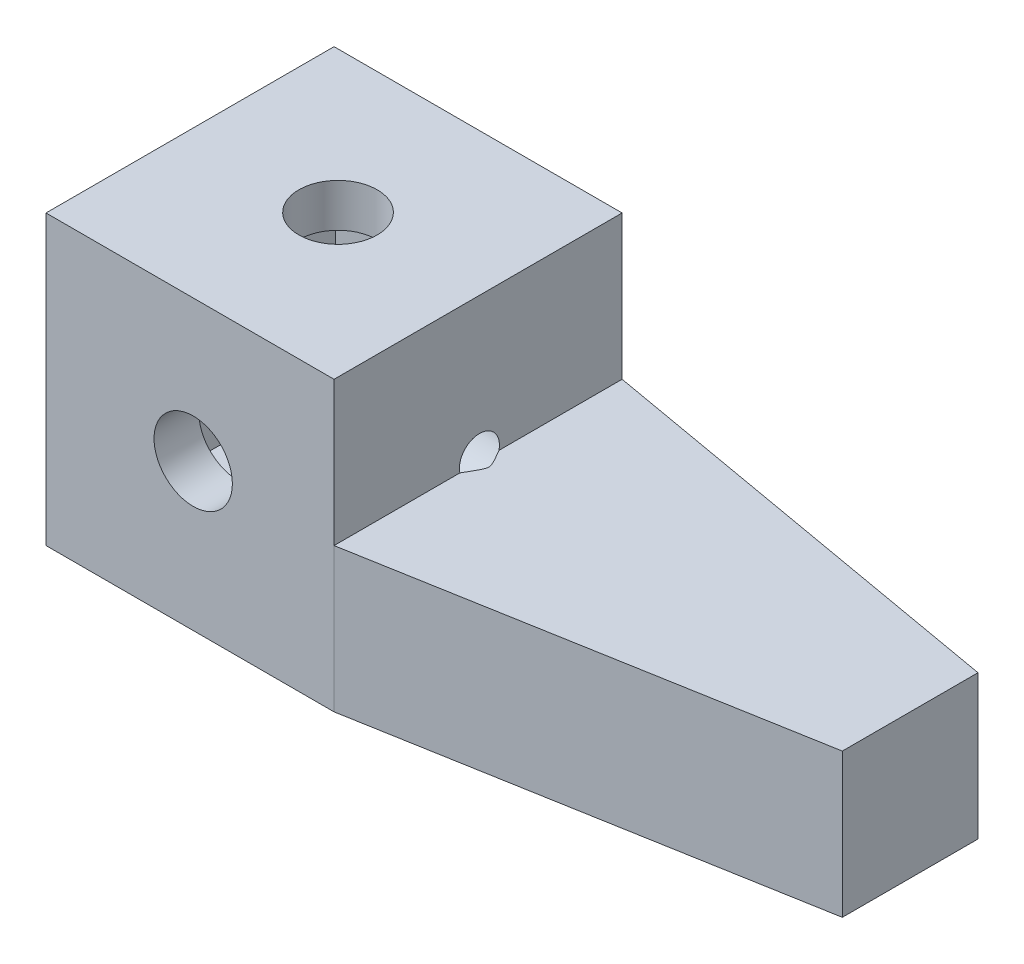
ISO-10303-21;
HEADER;
FILE_DESCRIPTION(('STEP AP214'),'2;1');
FILE_NAME('part.step','',(''),(''),'','','');
FILE_SCHEMA(('AUTOMOTIVE_DESIGN { 1 0 10303 214 1 1 1 1 }'));
ENDSEC;
DATA;
#1=APPLICATION_CONTEXT('core data for automotive mechanical design processes');
#2=APPLICATION_PROTOCOL_DEFINITION('international standard','automotive_design',2000,#1);
#3=PRODUCT_CONTEXT('',#1,'mechanical');
#4=PRODUCT('Part','Part','',(#3));
#5=PRODUCT_RELATED_PRODUCT_CATEGORY('part','',(#4));
#6=PRODUCT_DEFINITION_FORMATION('','',#4);
#7=PRODUCT_DEFINITION_CONTEXT('part definition',#1,'design');
#8=PRODUCT_DEFINITION('design','',#6,#7);
#9=PRODUCT_DEFINITION_SHAPE('','',#8);
#10=(LENGTH_UNIT() NAMED_UNIT(*) SI_UNIT(.MILLI.,.METRE.));
#11=(NAMED_UNIT(*) PLANE_ANGLE_UNIT() SI_UNIT($,.RADIAN.));
#12=(NAMED_UNIT(*) SI_UNIT($,.STERADIAN.) SOLID_ANGLE_UNIT());
#13=UNCERTAINTY_MEASURE_WITH_UNIT(LENGTH_MEASURE(1.E-05),#10,'distance_accuracy_value','');
#14=(GEOMETRIC_REPRESENTATION_CONTEXT(3) GLOBAL_UNCERTAINTY_ASSIGNED_CONTEXT((#13)) GLOBAL_UNIT_ASSIGNED_CONTEXT((#10,
#11,#12)) REPRESENTATION_CONTEXT('',''));
#15=CARTESIAN_POINT('',(0.,0.,0.));
#16=DIRECTION('',(0.,0.,1.));
#17=DIRECTION('',(1.,0.,0.));
#18=AXIS2_PLACEMENT_3D('',#15,#16,#17);
#19=CARTESIAN_POINT('',(0.,6.35,0.));
#20=DIRECTION('',(-0.173648177666934,0.,-0.984807753012207));
#21=DIRECTION('',(-0.984807753012208,0.,0.173648177666934));
#22=AXIS2_PLACEMENT_3D('',#19,#20,#21);
#23=PLANE('',#22);
#24=DIRECTION('',(0.984807753012207,0.,-0.173648177666934));
#25=VECTOR('',#24,1.);
#26=CARTESIAN_POINT('',(0.,0.,0.));
#27=LINE('',#26,#25);
#28=CARTESIAN_POINT('',(0.,0.,0.));
#29=VERTEX_POINT('',#28);
#30=CARTESIAN_POINT('',(19.05,0.,-3.35902898249633));
#31=VERTEX_POINT('',#30);
#32=EDGE_CURVE('E194',#29,#31,#27,.T.);
#33=ORIENTED_EDGE('',*,*,#32,.T.);
#34=DIRECTION('',(0.,-1.,0.));
#35=VECTOR('',#34,1.);
#36=CARTESIAN_POINT('',(19.05,6.35,-3.35902898249633));
#37=LINE('',#36,#35);
#38=CARTESIAN_POINT('',(19.05,6.35,-3.35902898249633));
#39=VERTEX_POINT('',#38);
#40=EDGE_CURVE('E186',#39,#31,#37,.T.);
#41=ORIENTED_EDGE('',*,*,#40,.F.);
#42=DIRECTION('',(0.984807753012207,0.,-0.173648177666934));
#43=VECTOR('',#42,1.);
#44=CARTESIAN_POINT('',(0.,6.35,0.));
#45=LINE('',#44,#43);
#46=CARTESIAN_POINT('',(0.,6.35,0.));
#47=VERTEX_POINT('',#46);
#48=EDGE_CURVE('E148',#47,#39,#45,.T.);
#49=ORIENTED_EDGE('',*,*,#48,.F.);
#50=DIRECTION('',(0.,-1.,0.));
#51=VECTOR('',#50,1.);
#52=CARTESIAN_POINT('',(0.,6.35,0.));
#53=LINE('',#52,#51);
#54=EDGE_CURVE('E48',#47,#29,#53,.T.);
#55=ORIENTED_EDGE('',*,*,#54,.T.);
#56=EDGE_LOOP('',(#33,#41,#49,#55));
#57=FACE_BOUND('',#56,.T.);
#58=ADVANCED_FACE('F36',(#57),#23,.F.);
#59=CARTESIAN_POINT('',(19.05,6.35,-3.35902898249633));
#60=DIRECTION('',(-1.,0.,0.));
#61=DIRECTION('',(0.,0.,1.));
#62=AXIS2_PLACEMENT_3D('',#59,#60,#61);
#63=PLANE('',#62);
#64=DIRECTION('',(0.,0.,-1.));
#65=VECTOR('',#64,1.);
#66=CARTESIAN_POINT('',(19.05,0.,-3.35902898249633));
#67=LINE('',#66,#65);
#68=CARTESIAN_POINT('',(19.05,0.,-9.34097101750367));
#69=VERTEX_POINT('',#68);
#70=EDGE_CURVE('E76',#31,#69,#67,.T.);
#71=ORIENTED_EDGE('',*,*,#70,.T.);
#72=DIRECTION('',(0.,-1.,0.));
#73=VECTOR('',#72,1.);
#74=CARTESIAN_POINT('',(19.05,6.35,-9.34097101750367));
#75=LINE('',#74,#73);
#76=CARTESIAN_POINT('',(19.05,6.35,-9.34097101750367));
#77=VERTEX_POINT('',#76);
#78=EDGE_CURVE('E180',#77,#69,#75,.T.);
#79=ORIENTED_EDGE('',*,*,#78,.F.);
#80=DIRECTION('',(0.,0.,-1.));
#81=VECTOR('',#80,1.);
#82=CARTESIAN_POINT('',(19.05,6.35,-3.35902898249633));
#83=LINE('',#82,#81);
#84=EDGE_CURVE('E62',#39,#77,#83,.T.);
#85=ORIENTED_EDGE('',*,*,#84,.F.);
#86=ORIENTED_EDGE('',*,*,#40,.T.);
#87=EDGE_LOOP('',(#71,#79,#85,#86));
#88=FACE_BOUND('',#87,.T.);
#89=ADVANCED_FACE('F307',(#88),#63,.F.);
#90=CARTESIAN_POINT('',(19.05,6.35,-9.34097101750367));
#91=DIRECTION('',(-0.173648177666934,0.,0.984807753012207));
#92=DIRECTION('',(0.984807753012208,0.,0.173648177666934));
#93=AXIS2_PLACEMENT_3D('',#90,#91,#92);
#94=PLANE('',#93);
#95=DIRECTION('',(-0.984807753012207,0.,-0.173648177666934));
#96=VECTOR('',#95,1.);
#97=CARTESIAN_POINT('',(19.05,0.,-9.34097101750367));
#98=LINE('',#97,#96);
#99=CARTESIAN_POINT('',(0.,0.,-12.7));
#100=VERTEX_POINT('',#99);
#101=EDGE_CURVE('E151',#69,#100,#98,.T.);
#102=ORIENTED_EDGE('',*,*,#101,.T.);
#103=DIRECTION('',(0.,-1.,0.));
#104=VECTOR('',#103,1.);
#105=CARTESIAN_POINT('',(0.,6.35,-12.7));
#106=LINE('',#105,#104);
#107=CARTESIAN_POINT('',(0.,6.35,-12.7));
#108=VERTEX_POINT('',#107);
#109=EDGE_CURVE('E178',#108,#100,#106,.T.);
#110=ORIENTED_EDGE('',*,*,#109,.F.);
#111=DIRECTION('',(-0.984807753012207,0.,-0.173648177666934));
#112=VECTOR('',#111,1.);
#113=CARTESIAN_POINT('',(19.05,6.35,-9.34097101750367));
#114=LINE('',#113,#112);
#115=EDGE_CURVE('E146',#77,#108,#114,.T.);
#116=ORIENTED_EDGE('',*,*,#115,.F.);
#117=ORIENTED_EDGE('',*,*,#78,.T.);
#118=EDGE_LOOP('',(#102,#110,#116,#117));
#119=FACE_BOUND('',#118,.T.);
#120=ADVANCED_FACE('F305',(#119),#94,.F.);
#121=CARTESIAN_POINT('',(0.,6.35,0.));
#122=DIRECTION('',(0.,1.,0.));
#123=DIRECTION('',(0.,0.,1.));
#124=AXIS2_PLACEMENT_3D('',#121,#122,#123);
#125=PLANE('',#124);
#126=CARTESIAN_POINT('',(-0.000250000000000094,6.35,-5.54862279225329));
#127=CARTESIAN_POINT('',(0.0207481982435829,6.35,-5.584431824616));
#128=CARTESIAN_POINT('',(0.0417101611081287,6.35,-5.62026226840634));
#129=CARTESIAN_POINT('',(0.0835000215352925,6.35,-5.69200839139629));
#130=CARTESIAN_POINT('',(0.104327898529392,6.35,-5.72792408256816));
#131=CARTESIAN_POINT('',(0.145665319925985,6.35,-5.79967047887335));
#132=CARTESIAN_POINT('',(0.166175994924332,6.35,-5.83550052950706));
#133=CARTESIAN_POINT('',(0.20685715533012,6.35,-5.90734854823297));
#134=CARTESIAN_POINT('',(0.227027671303398,6.35,-5.943366499056));
#135=CARTESIAN_POINT('',(0.268082791955404,6.35,-6.01810689782528));
#136=CARTESIAN_POINT('',(0.288927424859559,6.35,-6.05685174688178));
#137=CARTESIAN_POINT('',(0.31910307535204,6.35,-6.11567309302533));
#138=CARTESIAN_POINT('',(0.329006012935225,6.35,-6.13545412624062));
#139=CARTESIAN_POINT('',(0.348160643390142,6.35,-6.17532756405382));
#140=CARTESIAN_POINT('',(0.357412509898242,6.35,-6.19541988387613));
#141=CARTESIAN_POINT('',(0.376074037594145,6.35,-6.2389819069282));
#142=CARTESIAN_POINT('',(0.385317439892781,6.35,-6.26252405815339));
#143=CARTESIAN_POINT('',(0.400884606779155,6.35,-6.31041111853023));
#144=CARTESIAN_POINT('',(0.407236716857767,6.35,-6.33474561165937));
#145=CARTESIAN_POINT('',(0.412554321833245,6.35,-6.3694955848447));
#146=CARTESIAN_POINT('',(0.413665995468271,6.35,-6.37957341030234));
#147=CARTESIAN_POINT('',(0.414937459947851,6.35,-6.39978623039724));
#148=CARTESIAN_POINT('',(0.415097699349814,6.35,-6.40992119583937));
#149=CARTESIAN_POINT('',(0.414447818081358,6.35,-6.43020426261164));
#150=CARTESIAN_POINT('',(0.413633352287856,6.35,-6.44035221980154));
#151=CARTESIAN_POINT('',(0.41111232161901,6.35,-6.46053484176089));
#152=CARTESIAN_POINT('',(0.409405639748826,6.35,-6.47056949149618));
#153=CARTESIAN_POINT('',(0.401483873817946,6.35,-6.50862316543152));
#154=CARTESIAN_POINT('',(0.392720744550134,6.35,-6.53609113041692));
#155=CARTESIAN_POINT('',(0.372463627499578,6.35,-6.59001636948318));
#156=CARTESIAN_POINT('',(0.360956243566486,6.35,-6.61646792239984));
#157=CARTESIAN_POINT('',(0.336398789181616,6.35,-6.66932451917335));
#158=CARTESIAN_POINT('',(0.32332134799225,6.35,-6.69571686749976));
#159=CARTESIAN_POINT('',(0.296494662582725,6.35,-6.74806728646614));
#160=CARTESIAN_POINT('',(0.282747133275288,6.35,-6.77402625872335));
#161=CARTESIAN_POINT('',(0.246782178810428,6.35,-6.84069152208681));
#162=CARTESIAN_POINT('',(0.224267765265684,6.35,-6.88123739928289));
#163=CARTESIAN_POINT('',(0.178745099375974,6.35,-6.96209770018099));
#164=CARTESIAN_POINT('',(0.155736403746988,6.35,-7.00241187119246));
#165=CARTESIAN_POINT('',(0.110628125935711,6.35,-7.0808376859951));
#166=CARTESIAN_POINT('',(0.0885418777359445,6.35,-7.11895699644492));
#167=CARTESIAN_POINT('',(0.044232890600267,6.35,-7.19506482673303));
#168=CARTESIAN_POINT('',(0.0220103117535908,6.35,-7.23305343969612));
#169=CARTESIAN_POINT('',(-0.000249999999999622,6.35,-7.27101929034452));
#170=B_SPLINE_CURVE_WITH_KNOTS('',3,(#126,#127,#128,#129,#130,#131,#132,#133,#134,#135,#136,
#137,#138,#139,#140,#141,#142,#143,#144,#145,#146,#147,#148,#149,#150,#151,#152,#153,#154,#155,
#156,#157,#158,#159,#160,#161,#162,#163,#164,#165,#166,#167,#168,#169),.UNSPECIFIED.,.F.,.F.,(4,
2,2,2,2,2,2,2,2,2,2,2,2,2,2,2,2,2,2,2,2,4),(0.,0.124534867715077,0.249088404195827,
0.37294283155433,0.496786069718584,0.628754385733778,0.695112454197804,0.761452757801851,
0.837269910910502,0.912326855907599,0.94270272789841,0.973064277927133,1.00356168192244,
1.03406308599604,1.12014908218452,1.20666423615979,1.29500021831596,1.38312091821126,
1.52224392874413,1.66149739735129,1.79366318523238,1.92569570215536),.UNSPECIFIED.);
#171=CARTESIAN_POINT('',(0.,6.35,-5.54904899532055));
#172=VERTEX_POINT('',#171);
#173=CARTESIAN_POINT('',(0.,6.35,-7.27059308727726));
#174=VERTEX_POINT('',#173);
#175=EDGE_CURVE('E11',#172,#174,#170,.T.);
#176=ORIENTED_EDGE('',*,*,#175,.F.);
#177=DIRECTION('',(0.,0.,1.));
#178=VECTOR('',#177,1.);
#179=CARTESIAN_POINT('',(0.,6.35,-12.7));
#180=LINE('',#179,#178);
#181=EDGE_CURVE('E80',#172,#47,#180,.T.);
#182=ORIENTED_EDGE('',*,*,#181,.T.);
#183=ORIENTED_EDGE('',*,*,#48,.T.);
#184=ORIENTED_EDGE('',*,*,#84,.T.);
#185=ORIENTED_EDGE('',*,*,#115,.T.);
#186=EDGE_CURVE('E139',#108,#174,#180,.T.);
#187=ORIENTED_EDGE('',*,*,#186,.T.);
#188=EDGE_LOOP('',(#176,#182,#183,#184,#185,#187));
#189=FACE_BOUND('',#188,.T.);
#190=ADVANCED_FACE('F144',(#189),#125,.T.);
#191=CARTESIAN_POINT('',(0.,0.,0.));
#192=DIRECTION('',(0.,1.,0.));
#193=DIRECTION('',(0.,0.,1.));
#194=AXIS2_PLACEMENT_3D('',#191,#192,#193);
#195=PLANE('',#194);
#196=CARTESIAN_POINT('',(-6.28491584201883,0.,-6.46061631727329));
#197=DIRECTION('',(0.,1.,0.));
#198=DIRECTION('',(0.,0.,1.));
#199=AXIS2_PLACEMENT_3D('',#196,#197,#198);
#200=CIRCLE('',#199,0.881746022965921);
#201=CARTESIAN_POINT('',(-6.28491584201883,0.,-5.57887029430737));
#202=VERTEX_POINT('',#201);
#203=EDGE_CURVE('E166',#202,#202,#200,.T.);
#204=ORIENTED_EDGE('',*,*,#203,.T.);
#205=EDGE_LOOP('',(#204));
#206=FACE_BOUND('',#205,.T.);
#207=ORIENTED_EDGE('',*,*,#32,.F.);
#208=DIRECTION('',(1.,0.,0.));
#209=VECTOR('',#208,1.);
#210=CARTESIAN_POINT('',(0.,0.,0.));
#211=LINE('',#210,#209);
#212=CARTESIAN_POINT('',(-12.7,0.,0.));
#213=VERTEX_POINT('',#212);
#214=EDGE_CURVE('E210',#213,#29,#211,.T.);
#215=ORIENTED_EDGE('',*,*,#214,.F.);
#216=DIRECTION('',(0.,0.,1.));
#217=VECTOR('',#216,1.);
#218=CARTESIAN_POINT('',(-12.7,0.,0.));
#219=LINE('',#218,#217);
#220=CARTESIAN_POINT('',(-12.7,0.,-12.7));
#221=VERTEX_POINT('',#220);
#222=EDGE_CURVE('E213',#221,#213,#219,.T.);
#223=ORIENTED_EDGE('',*,*,#222,.F.);
#224=DIRECTION('',(-1.,0.,0.));
#225=VECTOR('',#224,1.);
#226=CARTESIAN_POINT('',(-12.7,0.,-12.7));
#227=LINE('',#226,#225);
#228=EDGE_CURVE('E215',#100,#221,#227,.T.);
#229=ORIENTED_EDGE('',*,*,#228,.F.);
#230=ORIENTED_EDGE('',*,*,#101,.F.);
#231=ORIENTED_EDGE('',*,*,#70,.F.);
#232=EDGE_LOOP('',(#207,#215,#223,#229,#230,#231));
#233=FACE_BOUND('',#232,.T.);
#234=ADVANCED_FACE('F300',(#206,#233),#195,.F.);
#235=CARTESIAN_POINT('',(0.,12.7,-12.7));
#236=DIRECTION('',(-1.,0.,0.));
#237=DIRECTION('',(0.,0.,1.));
#238=AXIS2_PLACEMENT_3D('',#235,#236,#237);
#239=PLANE('',#238);
#240=ORIENTED_EDGE('',*,*,#181,.F.);
#241=CARTESIAN_POINT('',(0.,6.5411740931153,-6.4098210412989));
#242=DIRECTION('',(-1.,0.,0.));
#243=DIRECTION('',(0.,0.,1.));
#244=AXIS2_PLACEMENT_3D('',#241,#242,#243);
#245=CIRCLE('',#244,0.88174602296592);
#246=EDGE_CURVE('E53',#172,#174,#245,.T.);
#247=ORIENTED_EDGE('',*,*,#246,.T.);
#248=ORIENTED_EDGE('',*,*,#186,.F.);
#249=DIRECTION('',(0.,-1.,0.));
#250=VECTOR('',#249,1.);
#251=CARTESIAN_POINT('',(0.,12.7,-12.7));
#252=LINE('',#251,#250);
#253=CARTESIAN_POINT('',(0.,12.7,-12.7));
#254=VERTEX_POINT('',#253);
#255=EDGE_CURVE('E195',#254,#108,#252,.T.);
#256=ORIENTED_EDGE('',*,*,#255,.F.);
#257=DIRECTION('',(0.,0.,-1.));
#258=VECTOR('',#257,1.);
#259=CARTESIAN_POINT('',(0.,12.7,-12.7));
#260=LINE('',#259,#258);
#261=CARTESIAN_POINT('',(0.,12.7,0.));
#262=VERTEX_POINT('',#261);
#263=EDGE_CURVE('E212',#262,#254,#260,.T.);
#264=ORIENTED_EDGE('',*,*,#263,.F.);
#265=DIRECTION('',(0.,-1.,0.));
#266=VECTOR('',#265,1.);
#267=CARTESIAN_POINT('',(0.,12.7,0.));
#268=LINE('',#267,#266);
#269=EDGE_CURVE('E160',#262,#47,#268,.T.);
#270=ORIENTED_EDGE('',*,*,#269,.T.);
#271=EDGE_LOOP('',(#240,#247,#248,#256,#264,#270));
#272=FACE_BOUND('',#271,.T.);
#273=ADVANCED_FACE('F137',(#272),#239,.F.);
#274=CARTESIAN_POINT('',(-12.7,12.7,-12.7));
#275=DIRECTION('',(0.,0.,1.));
#276=DIRECTION('',(1.,0.,0.));
#277=AXIS2_PLACEMENT_3D('',#274,#275,#276);
#278=PLANE('',#277);
#279=CARTESIAN_POINT('',(-6.21010654448004,6.46796242461151,-12.7));
#280=DIRECTION('',(0.,0.,-1.));
#281=DIRECTION('',(-1.,0.,0.));
#282=AXIS2_PLACEMENT_3D('',#279,#280,#281);
#283=CIRCLE('',#282,1.72719999999999);
#284=CARTESIAN_POINT('',(-7.93730654448003,6.46796242461151,-12.7));
#285=VERTEX_POINT('',#284);
#286=EDGE_CURVE('E258',#285,#285,#283,.T.);
#287=ORIENTED_EDGE('',*,*,#286,.F.);
#288=EDGE_LOOP('',(#287));
#289=FACE_BOUND('',#288,.T.);
#290=ORIENTED_EDGE('',*,*,#228,.T.);
#291=DIRECTION('',(0.,-1.,0.));
#292=VECTOR('',#291,1.);
#293=CARTESIAN_POINT('',(-12.7,12.7,-12.7));
#294=LINE('',#293,#292);
#295=CARTESIAN_POINT('',(-12.7,12.7,-12.7));
#296=VERTEX_POINT('',#295);
#297=EDGE_CURVE('E200',#296,#221,#294,.T.);
#298=ORIENTED_EDGE('',*,*,#297,.F.);
#299=DIRECTION('',(-1.,0.,0.));
#300=VECTOR('',#299,1.);
#301=CARTESIAN_POINT('',(-12.7,12.7,-12.7));
#302=LINE('',#301,#300);
#303=EDGE_CURVE('E222',#254,#296,#302,.T.);
#304=ORIENTED_EDGE('',*,*,#303,.F.);
#305=ORIENTED_EDGE('',*,*,#255,.T.);
#306=ORIENTED_EDGE('',*,*,#109,.T.);
#307=EDGE_LOOP('',(#290,#298,#304,#305,#306));
#308=FACE_BOUND('',#307,.T.);
#309=ADVANCED_FACE('F288',(#289,#308),#278,.F.);
#310=CARTESIAN_POINT('',(-12.7,12.7,0.));
#311=DIRECTION('',(1.,0.,0.));
#312=DIRECTION('',(0.,0.,-1.));
#313=AXIS2_PLACEMENT_3D('',#310,#311,#312);
#314=PLANE('',#313);
#315=CARTESIAN_POINT('',(-12.7,6.5411740931153,-6.4098210412989));
#316=DIRECTION('',(-1.,0.,0.));
#317=DIRECTION('',(0.,0.,1.));
#318=AXIS2_PLACEMENT_3D('',#315,#316,#317);
#319=CIRCLE('',#318,1.72719999999999);
#320=CARTESIAN_POINT('',(-12.7,6.5411740931153,-4.68262104129891));
#321=VERTEX_POINT('',#320);
#322=EDGE_CURVE('E278',#321,#321,#319,.T.);
#323=ORIENTED_EDGE('',*,*,#322,.F.);
#324=EDGE_LOOP('',(#323));
#325=FACE_BOUND('',#324,.T.);
#326=ORIENTED_EDGE('',*,*,#222,.T.);
#327=DIRECTION('',(0.,-1.,0.));
#328=VECTOR('',#327,1.);
#329=CARTESIAN_POINT('',(-12.7,12.7,0.));
#330=LINE('',#329,#328);
#331=CARTESIAN_POINT('',(-12.7,12.7,0.));
#332=VERTEX_POINT('',#331);
#333=EDGE_CURVE('E202',#332,#213,#330,.T.);
#334=ORIENTED_EDGE('',*,*,#333,.F.);
#335=DIRECTION('',(0.,0.,1.));
#336=VECTOR('',#335,1.);
#337=CARTESIAN_POINT('',(-12.7,12.7,0.));
#338=LINE('',#337,#336);
#339=EDGE_CURVE('E220',#296,#332,#338,.T.);
#340=ORIENTED_EDGE('',*,*,#339,.F.);
#341=ORIENTED_EDGE('',*,*,#297,.T.);
#342=EDGE_LOOP('',(#326,#334,#340,#341));
#343=FACE_BOUND('',#342,.T.);
#344=ADVANCED_FACE('F284',(#325,#343),#314,.F.);
#345=CARTESIAN_POINT('',(0.,12.7,0.));
#346=DIRECTION('',(0.,0.,-1.));
#347=DIRECTION('',(-1.,0.,0.));
#348=AXIS2_PLACEMENT_3D('',#345,#346,#347);
#349=PLANE('',#348);
#350=CARTESIAN_POINT('',(-6.21010654448004,6.46796242461151,0.));
#351=DIRECTION('',(0.,0.,1.));
#352=DIRECTION('',(1.,0.,0.));
#353=AXIS2_PLACEMENT_3D('',#350,#351,#352);
#354=CIRCLE('',#353,1.72719999999999);
#355=CARTESIAN_POINT('',(-4.48290654448005,6.46796242461151,0.));
#356=VERTEX_POINT('',#355);
#357=EDGE_CURVE('E175',#356,#356,#354,.T.);
#358=ORIENTED_EDGE('',*,*,#357,.F.);
#359=EDGE_LOOP('',(#358));
#360=FACE_BOUND('',#359,.T.);
#361=ORIENTED_EDGE('',*,*,#214,.T.);
#362=ORIENTED_EDGE('',*,*,#54,.F.);
#363=ORIENTED_EDGE('',*,*,#269,.F.);
#364=DIRECTION('',(1.,0.,0.));
#365=VECTOR('',#364,1.);
#366=CARTESIAN_POINT('',(0.,12.7,0.));
#367=LINE('',#366,#365);
#368=EDGE_CURVE('E218',#332,#262,#367,.T.);
#369=ORIENTED_EDGE('',*,*,#368,.F.);
#370=ORIENTED_EDGE('',*,*,#333,.T.);
#371=EDGE_LOOP('',(#361,#362,#363,#369,#370));
#372=FACE_BOUND('',#371,.T.);
#373=ADVANCED_FACE('F287',(#360,#372),#349,.F.);
#374=CARTESIAN_POINT('',(0.,12.7,0.));
#375=DIRECTION('',(0.,-1.,0.));
#376=DIRECTION('',(0.,0.,-1.));
#377=AXIS2_PLACEMENT_3D('',#374,#375,#376);
#378=PLANE('',#377);
#379=CARTESIAN_POINT('',(-6.28491584201883,12.7,-6.46061631727329));
#380=DIRECTION('',(0.,1.,0.));
#381=DIRECTION('',(0.,0.,1.));
#382=AXIS2_PLACEMENT_3D('',#379,#380,#381);
#383=CIRCLE('',#382,1.72719999999999);
#384=CARTESIAN_POINT('',(-6.28491584201883,12.7,-4.7334163172733));
#385=VERTEX_POINT('',#384);
#386=EDGE_CURVE('E268',#385,#385,#383,.T.);
#387=ORIENTED_EDGE('',*,*,#386,.F.);
#388=EDGE_LOOP('',(#387));
#389=FACE_BOUND('',#388,.T.);
#390=ORIENTED_EDGE('',*,*,#263,.T.);
#391=ORIENTED_EDGE('',*,*,#303,.T.);
#392=ORIENTED_EDGE('',*,*,#339,.T.);
#393=ORIENTED_EDGE('',*,*,#368,.T.);
#394=EDGE_LOOP('',(#390,#391,#392,#393));
#395=FACE_BOUND('',#394,.T.);
#396=ADVANCED_FACE('F304',(#389,#395),#378,.F.);
#397=CARTESIAN_POINT('',(-6.21010654448004,6.46796242461151,0.));
#398=DIRECTION('',(0.,0.,1.));
#399=DIRECTION('',(1.,0.,0.));
#400=AXIS2_PLACEMENT_3D('',#397,#398,#399);
#401=CYLINDRICAL_SURFACE('',#400,1.72719999999999);
#402=CARTESIAN_POINT('',(-6.21010654448004,6.46796242461151,-10.8663173616697));
#403=DIRECTION('',(0.,0.,1.));
#404=DIRECTION('',(1.,0.,0.));
#405=AXIS2_PLACEMENT_3D('',#402,#403,#404);
#406=CIRCLE('',#405,1.72719999999999);
#407=CARTESIAN_POINT('',(-4.48290654448005,6.46796242461151,-10.8663173616697));
#408=VERTEX_POINT('',#407);
#409=EDGE_CURVE('E171',#408,#408,#406,.T.);
#410=ORIENTED_EDGE('',*,*,#409,.T.);
#411=EDGE_LOOP('',(#410));
#412=FACE_BOUND('',#411,.T.);
#413=ORIENTED_EDGE('',*,*,#286,.T.);
#414=EDGE_LOOP('',(#413));
#415=FACE_BOUND('',#414,.T.);
#416=ADVANCED_FACE('F380',(#412,#415),#401,.F.);
#417=ORIENTED_EDGE('',*,*,#357,.T.);
#418=EDGE_LOOP('',(#417));
#419=FACE_BOUND('',#418,.T.);
#420=CARTESIAN_POINT('',(-6.21010654448004,6.46796242461151,-1.97631736166967));
#421=DIRECTION('',(0.,0.,-1.));
#422=DIRECTION('',(-1.,0.,0.));
#423=AXIS2_PLACEMENT_3D('',#420,#421,#422);
#424=CIRCLE('',#423,1.72719999999999);
#425=CARTESIAN_POINT('',(-7.93730654448004,6.46796242461151,-1.97631736166967));
#426=VERTEX_POINT('',#425);
#427=EDGE_CURVE('E174',#426,#426,#424,.T.);
#428=ORIENTED_EDGE('',*,*,#427,.T.);
#429=EDGE_LOOP('',(#428));
#430=FACE_BOUND('',#429,.T.);
#431=ADVANCED_FACE('F391',(#419,#430),#401,.F.);
#432=CARTESIAN_POINT('',(-10.795,10.795,-1.97631736166967));
#433=DIRECTION('',(0.,0.,-1.));
#434=DIRECTION('',(-1.,0.,0.));
#435=AXIS2_PLACEMENT_3D('',#432,#433,#434);
#436=PLANE('',#435);
#437=ORIENTED_EDGE('',*,*,#427,.F.);
#438=EDGE_LOOP('',(#437));
#439=FACE_BOUND('',#438,.T.);
#440=DIRECTION('',(0.,-1.,0.));
#441=VECTOR('',#440,1.);
#442=CARTESIAN_POINT('',(-10.795,10.795,-1.97631736166967));
#443=LINE('',#442,#441);
#444=CARTESIAN_POINT('',(-10.795,10.795,-1.97631736166967));
#445=VERTEX_POINT('',#444);
#446=CARTESIAN_POINT('',(-10.795,1.905,-1.97631736166967));
#447=VERTEX_POINT('',#446);
#448=EDGE_CURVE('E231',#445,#447,#443,.T.);
#449=ORIENTED_EDGE('',*,*,#448,.F.);
#450=DIRECTION('',(1.,0.,0.));
#451=VECTOR('',#450,1.);
#452=CARTESIAN_POINT('',(-10.795,10.795,-1.97631736166967));
#453=LINE('',#452,#451);
#454=CARTESIAN_POINT('',(-1.905,10.795,-1.97631736166967));
#455=VERTEX_POINT('',#454);
#456=EDGE_CURVE('E239',#445,#455,#453,.T.);
#457=ORIENTED_EDGE('',*,*,#456,.T.);
#458=DIRECTION('',(0.,-1.,0.));
#459=VECTOR('',#458,1.);
#460=CARTESIAN_POINT('',(-1.905,10.795,-1.97631736166967));
#461=LINE('',#460,#459);
#462=CARTESIAN_POINT('',(-1.905,1.905,-1.97631736166967));
#463=VERTEX_POINT('',#462);
#464=EDGE_CURVE('E217',#455,#463,#461,.T.);
#465=ORIENTED_EDGE('',*,*,#464,.T.);
#466=DIRECTION('',(1.,0.,0.));
#467=VECTOR('',#466,1.);
#468=CARTESIAN_POINT('',(-10.795,1.905,-1.97631736166967));
#469=LINE('',#468,#467);
#470=EDGE_CURVE('E251',#447,#463,#469,.T.);
#471=ORIENTED_EDGE('',*,*,#470,.F.);
#472=EDGE_LOOP('',(#449,#457,#465,#471));
#473=FACE_BOUND('',#472,.T.);
#474=ADVANCED_FACE('F385',(#439,#473),#436,.T.);
#475=CARTESIAN_POINT('',(-1.905,10.795,-1.97631736166967));
#476=DIRECTION('',(-1.,0.,0.));
#477=DIRECTION('',(0.,0.,1.));
#478=AXIS2_PLACEMENT_3D('',#475,#476,#477);
#479=PLANE('',#478);
#480=CARTESIAN_POINT('',(-1.905,6.5411740931153,-6.4098210412989));
#481=DIRECTION('',(-1.,0.,0.));
#482=DIRECTION('',(0.,0.,1.));
#483=AXIS2_PLACEMENT_3D('',#480,#481,#482);
#484=CIRCLE('',#483,1.72719999999999);
#485=CARTESIAN_POINT('',(-1.905,6.5411740931153,-4.68262104129891));
#486=VERTEX_POINT('',#485);
#487=EDGE_CURVE('E141',#486,#486,#484,.T.);
#488=ORIENTED_EDGE('',*,*,#487,.F.);
#489=EDGE_LOOP('',(#488));
#490=FACE_BOUND('',#489,.T.);
#491=ORIENTED_EDGE('',*,*,#464,.F.);
#492=DIRECTION('',(0.,0.,-1.));
#493=VECTOR('',#492,1.);
#494=CARTESIAN_POINT('',(-1.905,10.795,-1.97631736166967));
#495=LINE('',#494,#493);
#496=CARTESIAN_POINT('',(-1.905,10.795,-10.8663173616697));
#497=VERTEX_POINT('',#496);
#498=EDGE_CURVE('E237',#455,#497,#495,.T.);
#499=ORIENTED_EDGE('',*,*,#498,.T.);
#500=DIRECTION('',(0.,-1.,0.));
#501=VECTOR('',#500,1.);
#502=CARTESIAN_POINT('',(-1.905,10.795,-10.8663173616697));
#503=LINE('',#502,#501);
#504=CARTESIAN_POINT('',(-1.905,1.905,-10.8663173616697));
#505=VERTEX_POINT('',#504);
#506=EDGE_CURVE('E227',#497,#505,#503,.T.);
#507=ORIENTED_EDGE('',*,*,#506,.T.);
#508=DIRECTION('',(0.,0.,-1.));
#509=VECTOR('',#508,1.);
#510=CARTESIAN_POINT('',(-1.905,1.905,-1.97631736166967));
#511=LINE('',#510,#509);
#512=EDGE_CURVE('E248',#463,#505,#511,.T.);
#513=ORIENTED_EDGE('',*,*,#512,.F.);
#514=EDGE_LOOP('',(#491,#499,#507,#513));
#515=FACE_BOUND('',#514,.T.);
#516=ADVANCED_FACE('F390',(#490,#515),#479,.T.);
#517=CARTESIAN_POINT('',(-1.905,10.795,-10.8663173616697));
#518=DIRECTION('',(0.,0.,1.));
#519=DIRECTION('',(1.,0.,0.));
#520=AXIS2_PLACEMENT_3D('',#517,#518,#519);
#521=PLANE('',#520);
#522=ORIENTED_EDGE('',*,*,#409,.F.);
#523=EDGE_LOOP('',(#522));
#524=FACE_BOUND('',#523,.T.);
#525=ORIENTED_EDGE('',*,*,#506,.F.);
#526=DIRECTION('',(-1.,0.,0.));
#527=VECTOR('',#526,1.);
#528=CARTESIAN_POINT('',(-1.905,10.795,-10.8663173616697));
#529=LINE('',#528,#527);
#530=CARTESIAN_POINT('',(-10.795,10.795,-10.8663173616697));
#531=VERTEX_POINT('',#530);
#532=EDGE_CURVE('E235',#497,#531,#529,.T.);
#533=ORIENTED_EDGE('',*,*,#532,.T.);
#534=DIRECTION('',(0.,-1.,0.));
#535=VECTOR('',#534,1.);
#536=CARTESIAN_POINT('',(-10.795,10.795,-10.8663173616697));
#537=LINE('',#536,#535);
#538=CARTESIAN_POINT('',(-10.795,1.905,-10.8663173616697));
#539=VERTEX_POINT('',#538);
#540=EDGE_CURVE('E229',#531,#539,#537,.T.);
#541=ORIENTED_EDGE('',*,*,#540,.T.);
#542=DIRECTION('',(-1.,0.,0.));
#543=VECTOR('',#542,1.);
#544=CARTESIAN_POINT('',(-1.905,1.905,-10.8663173616697));
#545=LINE('',#544,#543);
#546=EDGE_CURVE('E245',#505,#539,#545,.T.);
#547=ORIENTED_EDGE('',*,*,#546,.F.);
#548=EDGE_LOOP('',(#525,#533,#541,#547));
#549=FACE_BOUND('',#548,.T.);
#550=ADVANCED_FACE('F400',(#524,#549),#521,.T.);
#551=CARTESIAN_POINT('',(-10.795,10.795,-10.8663173616697));
#552=DIRECTION('',(1.,0.,0.));
#553=DIRECTION('',(0.,0.,-1.));
#554=AXIS2_PLACEMENT_3D('',#551,#552,#553);
#555=PLANE('',#554);
#556=CARTESIAN_POINT('',(-10.795,6.5411740931153,-6.4098210412989));
#557=DIRECTION('',(1.,0.,0.));
#558=DIRECTION('',(0.,0.,-1.));
#559=AXIS2_PLACEMENT_3D('',#556,#557,#558);
#560=CIRCLE('',#559,1.72719999999999);
#561=CARTESIAN_POINT('',(-10.795,6.5411740931153,-8.13702104129889));
#562=VERTEX_POINT('',#561);
#563=EDGE_CURVE('E271',#562,#562,#560,.T.);
#564=ORIENTED_EDGE('',*,*,#563,.F.);
#565=EDGE_LOOP('',(#564));
#566=FACE_BOUND('',#565,.T.);
#567=ORIENTED_EDGE('',*,*,#540,.F.);
#568=DIRECTION('',(0.,0.,1.));
#569=VECTOR('',#568,1.);
#570=CARTESIAN_POINT('',(-10.795,10.795,-10.8663173616697));
#571=LINE('',#570,#569);
#572=EDGE_CURVE('E233',#531,#445,#571,.T.);
#573=ORIENTED_EDGE('',*,*,#572,.T.);
#574=ORIENTED_EDGE('',*,*,#448,.T.);
#575=DIRECTION('',(0.,0.,1.));
#576=VECTOR('',#575,1.);
#577=CARTESIAN_POINT('',(-10.795,1.905,-10.8663173616697));
#578=LINE('',#577,#576);
#579=EDGE_CURVE('E242',#539,#447,#578,.T.);
#580=ORIENTED_EDGE('',*,*,#579,.F.);
#581=EDGE_LOOP('',(#567,#573,#574,#580));
#582=FACE_BOUND('',#581,.T.);
#583=ADVANCED_FACE('F409',(#566,#582),#555,.T.);
#584=CARTESIAN_POINT('',(0.,10.795,0.));
#585=DIRECTION('',(0.,1.,0.));
#586=DIRECTION('',(0.,0.,1.));
#587=AXIS2_PLACEMENT_3D('',#584,#585,#586);
#588=PLANE('',#587);
#589=CARTESIAN_POINT('',(-6.28491584201883,10.795,-6.46061631727329));
#590=DIRECTION('',(0.,1.,0.));
#591=DIRECTION('',(0.,0.,1.));
#592=AXIS2_PLACEMENT_3D('',#589,#590,#591);
#593=CIRCLE('',#592,1.72719999999999);
#594=CARTESIAN_POINT('',(-6.28491584201883,10.795,-4.7334163172733));
#595=VERTEX_POINT('',#594);
#596=EDGE_CURVE('E261',#595,#595,#593,.T.);
#597=ORIENTED_EDGE('',*,*,#596,.T.);
#598=EDGE_LOOP('',(#597));
#599=FACE_BOUND('',#598,.T.);
#600=ORIENTED_EDGE('',*,*,#456,.F.);
#601=ORIENTED_EDGE('',*,*,#572,.F.);
#602=ORIENTED_EDGE('',*,*,#532,.F.);
#603=ORIENTED_EDGE('',*,*,#498,.F.);
#604=EDGE_LOOP('',(#600,#601,#602,#603));
#605=FACE_BOUND('',#604,.T.);
#606=ADVANCED_FACE('F418',(#599,#605),#588,.F.);
#607=CARTESIAN_POINT('',(0.,1.905,0.));
#608=DIRECTION('',(0.,1.,0.));
#609=DIRECTION('',(0.,0.,1.));
#610=AXIS2_PLACEMENT_3D('',#607,#608,#609);
#611=PLANE('',#610);
#612=CARTESIAN_POINT('',(-6.28491584201883,1.905,-6.46061631727329));
#613=DIRECTION('',(0.,1.,0.));
#614=DIRECTION('',(0.,0.,1.));
#615=AXIS2_PLACEMENT_3D('',#612,#613,#614);
#616=CIRCLE('',#615,1.72719999999999);
#617=CARTESIAN_POINT('',(-6.28491584201883,1.905,-4.7334163172733));
#618=VERTEX_POINT('',#617);
#619=EDGE_CURVE('E169',#618,#618,#616,.T.);
#620=ORIENTED_EDGE('',*,*,#619,.F.);
#621=EDGE_LOOP('',(#620));
#622=FACE_BOUND('',#621,.T.);
#623=ORIENTED_EDGE('',*,*,#470,.T.);
#624=ORIENTED_EDGE('',*,*,#512,.T.);
#625=ORIENTED_EDGE('',*,*,#546,.T.);
#626=ORIENTED_EDGE('',*,*,#579,.T.);
#627=EDGE_LOOP('',(#623,#624,#625,#626));
#628=FACE_BOUND('',#627,.T.);
#629=ADVANCED_FACE('F427',(#622,#628),#611,.T.);
#630=CARTESIAN_POINT('',(-6.28491584201883,12.7,-6.46061631727329));
#631=DIRECTION('',(0.,1.,0.));
#632=DIRECTION('',(0.,0.,1.));
#633=AXIS2_PLACEMENT_3D('',#630,#631,#632);
#634=CYLINDRICAL_SURFACE('',#633,1.72719999999999);
#635=ORIENTED_EDGE('',*,*,#619,.T.);
#636=EDGE_LOOP('',(#635));
#637=FACE_BOUND('',#636,.T.);
#638=CARTESIAN_POINT('',(-6.28491584201883,0.508000000000005,-6.46061631727329));
#639=DIRECTION('',(0.,1.,0.));
#640=DIRECTION('',(0.,0.,1.));
#641=AXIS2_PLACEMENT_3D('',#638,#639,#640);
#642=CIRCLE('',#641,1.72719999999999);
#643=CARTESIAN_POINT('',(-6.28491584201883,0.508000000000005,-4.7334163172733));
#644=VERTEX_POINT('',#643);
#645=EDGE_CURVE('E170',#644,#644,#642,.T.);
#646=ORIENTED_EDGE('',*,*,#645,.F.);
#647=EDGE_LOOP('',(#646));
#648=FACE_BOUND('',#647,.T.);
#649=ADVANCED_FACE('F436',(#637,#648),#634,.F.);
#650=CARTESIAN_POINT('',(-6.28491584201883,0.508000000000005,-6.46061631727329));
#651=DIRECTION('',(0.,1.,0.));
#652=DIRECTION('',(0.,0.,1.));
#653=AXIS2_PLACEMENT_3D('',#650,#651,#652);
#654=CONICAL_SURFACE('',#653,1.72719999999999,1.02974425867665);
#655=ORIENTED_EDGE('',*,*,#645,.T.);
#656=EDGE_LOOP('',(#655));
#657=FACE_BOUND('',#656,.T.);
#658=ORIENTED_EDGE('',*,*,#203,.F.);
#659=EDGE_LOOP('',(#658));
#660=FACE_BOUND('',#659,.T.);
#661=ADVANCED_FACE('F470',(#657,#660),#654,.F.);
#662=ORIENTED_EDGE('',*,*,#386,.T.);
#663=EDGE_LOOP('',(#662));
#664=FACE_BOUND('',#663,.T.);
#665=ORIENTED_EDGE('',*,*,#596,.F.);
#666=EDGE_LOOP('',(#665));
#667=FACE_BOUND('',#666,.T.);
#668=ADVANCED_FACE('F473',(#664,#667),#634,.F.);
#669=CARTESIAN_POINT('',(-12.7,6.5411740931153,-6.4098210412989));
#670=DIRECTION('',(-1.,0.,0.));
#671=DIRECTION('',(0.,0.,1.));
#672=AXIS2_PLACEMENT_3D('',#669,#670,#671);
#673=CYLINDRICAL_SURFACE('',#672,1.72719999999999);
#674=ORIENTED_EDGE('',*,*,#487,.T.);
#675=EDGE_LOOP('',(#674));
#676=FACE_BOUND('',#675,.T.);
#677=CARTESIAN_POINT('',(-0.508000000000005,6.5411740931153,-6.4098210412989));
#678=DIRECTION('',(-1.,0.,0.));
#679=DIRECTION('',(0.,0.,1.));
#680=AXIS2_PLACEMENT_3D('',#677,#678,#679);
#681=CIRCLE('',#680,1.72719999999999);
#682=CARTESIAN_POINT('',(-0.508000000000005,6.5411740931153,-4.68262104129892));
#683=VERTEX_POINT('',#682);
#684=EDGE_CURVE('E142',#683,#683,#681,.T.);
#685=ORIENTED_EDGE('',*,*,#684,.F.);
#686=EDGE_LOOP('',(#685));
#687=FACE_BOUND('',#686,.T.);
#688=ADVANCED_FACE('F491',(#676,#687),#673,.F.);
#689=CARTESIAN_POINT('',(-0.508000000000005,6.5411740931153,-6.4098210412989));
#690=DIRECTION('',(-1.,0.,0.));
#691=DIRECTION('',(0.,0.,1.));
#692=AXIS2_PLACEMENT_3D('',#689,#690,#691);
#693=CONICAL_SURFACE('',#692,1.72719999999999,1.02974425867665);
#694=ORIENTED_EDGE('',*,*,#684,.T.);
#695=EDGE_LOOP('',(#694));
#696=FACE_BOUND('',#695,.T.);
#697=ORIENTED_EDGE('',*,*,#175,.T.);
#698=ORIENTED_EDGE('',*,*,#246,.F.);
#699=EDGE_LOOP('',(#697,#698));
#700=FACE_BOUND('',#699,.T.);
#701=ADVANCED_FACE('F134',(#696,#700),#693,.F.);
#702=ORIENTED_EDGE('',*,*,#563,.T.);
#703=EDGE_LOOP('',(#702));
#704=FACE_BOUND('',#703,.T.);
#705=ORIENTED_EDGE('',*,*,#322,.T.);
#706=EDGE_LOOP('',(#705));
#707=FACE_BOUND('',#706,.T.);
#708=ADVANCED_FACE('F282',(#704,#707),#673,.F.);
#709=CLOSED_SHELL('',(#58,#89,#120,#190,#234,#273,#309,#344,#373,#396,#416,#431,#474,#516,#550,
#583,#606,#629,#649,#661,#668,#688,#701,#708));
#710=MANIFOLD_SOLID_BREP('B2',#709);
#711=ADVANCED_BREP_SHAPE_REPRESENTATION('',(#18,#710),#14);
#712=SHAPE_DEFINITION_REPRESENTATION(#9,#711);
ENDSEC;
END-ISO-10303-21;
